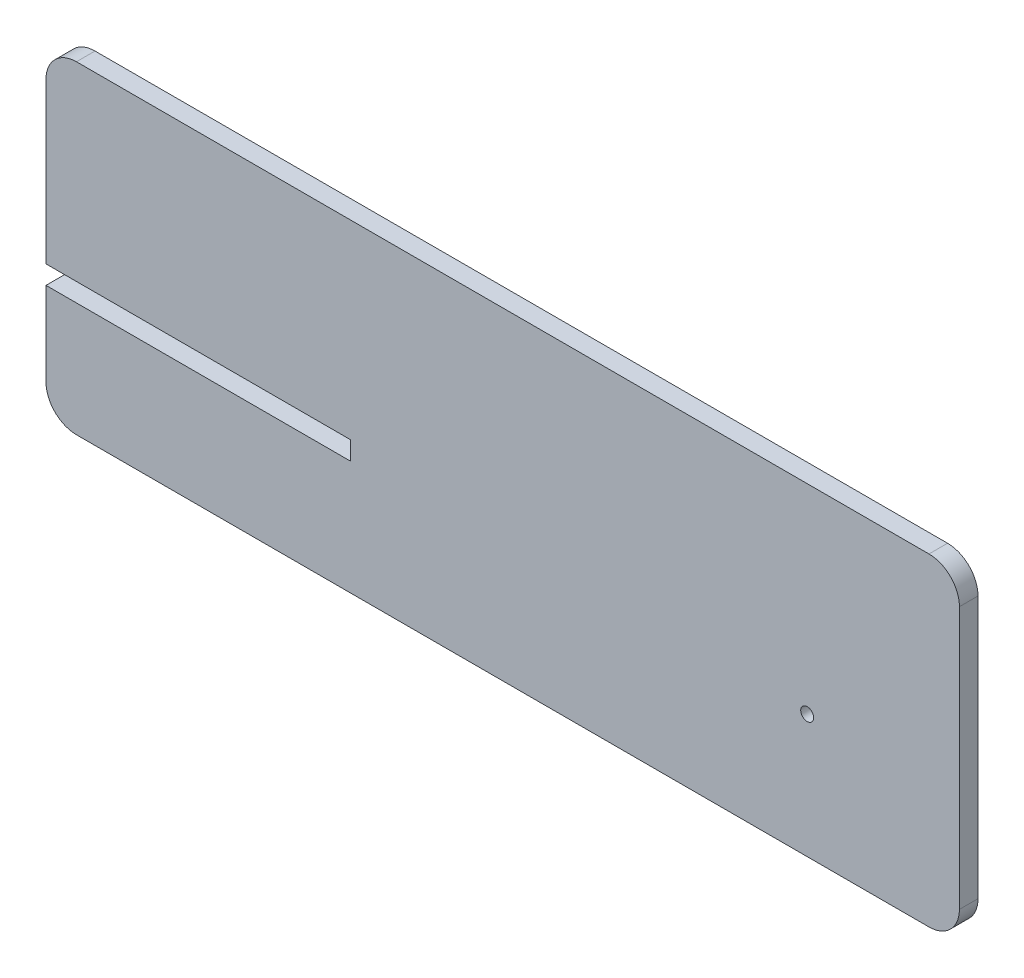
ISO-10303-21;
HEADER;
FILE_DESCRIPTION(('STEP AP214'),'2;1');
FILE_NAME('part.step','',(''),(''),'','','');
FILE_SCHEMA(('AUTOMOTIVE_DESIGN { 1 0 10303 214 1 1 1 1 }'));
ENDSEC;
DATA;
#1=APPLICATION_CONTEXT('core data for automotive mechanical design processes');
#2=APPLICATION_PROTOCOL_DEFINITION('international standard','automotive_design',2000,#1);
#3=PRODUCT_CONTEXT('',#1,'mechanical');
#4=PRODUCT('Part','Part','',(#3));
#5=PRODUCT_RELATED_PRODUCT_CATEGORY('part','',(#4));
#6=PRODUCT_DEFINITION_FORMATION('','',#4);
#7=PRODUCT_DEFINITION_CONTEXT('part definition',#1,'design');
#8=PRODUCT_DEFINITION('design','',#6,#7);
#9=PRODUCT_DEFINITION_SHAPE('','',#8);
#10=(LENGTH_UNIT() NAMED_UNIT(*) SI_UNIT(.MILLI.,.METRE.));
#11=(NAMED_UNIT(*) PLANE_ANGLE_UNIT() SI_UNIT($,.RADIAN.));
#12=(NAMED_UNIT(*) SI_UNIT($,.STERADIAN.) SOLID_ANGLE_UNIT());
#13=UNCERTAINTY_MEASURE_WITH_UNIT(LENGTH_MEASURE(1.E-05),#10,'distance_accuracy_value','');
#14=(GEOMETRIC_REPRESENTATION_CONTEXT(3) GLOBAL_UNCERTAINTY_ASSIGNED_CONTEXT((#13)) GLOBAL_UNIT_ASSIGNED_CONTEXT((#10,
#11,#12)) REPRESENTATION_CONTEXT('',''));
#15=CARTESIAN_POINT('',(0.,0.,0.));
#16=DIRECTION('',(0.,0.,1.));
#17=DIRECTION('',(1.,0.,0.));
#18=AXIS2_PLACEMENT_3D('',#15,#16,#17);
#19=CARTESIAN_POINT('',(-50.8,1.5494,3.0988));
#20=DIRECTION('',(1.,0.,0.));
#21=DIRECTION('',(0.,0.,-1.));
#22=AXIS2_PLACEMENT_3D('',#19,#20,#21);
#23=PLANE('',#22);
#24=DIRECTION('',(0.,-1.,0.));
#25=VECTOR('',#24,1.);
#26=CARTESIAN_POINT('',(-50.8,1.5494,3.0988));
#27=LINE('',#26,#25);
#28=CARTESIAN_POINT('',(-50.8,28.2194,3.0988));
#29=VERTEX_POINT('',#28);
#30=CARTESIAN_POINT('',(-50.8,1.5494,3.0988));
#31=VERTEX_POINT('',#30);
#32=EDGE_CURVE('E126',#29,#31,#27,.T.);
#33=ORIENTED_EDGE('',*,*,#32,.F.);
#34=DIRECTION('',(0.,0.,-1.));
#35=VECTOR('',#34,1.);
#36=CARTESIAN_POINT('',(-50.8,28.2194,3.0988));
#37=LINE('',#36,#35);
#38=CARTESIAN_POINT('',(-50.8,28.2194,0.));
#39=VERTEX_POINT('',#38);
#40=EDGE_CURVE('E11',#29,#39,#37,.T.);
#41=ORIENTED_EDGE('',*,*,#40,.T.);
#42=DIRECTION('',(0.,-1.,0.));
#43=VECTOR('',#42,1.);
#44=CARTESIAN_POINT('',(-50.8,1.5494,0.));
#45=LINE('',#44,#43);
#46=CARTESIAN_POINT('',(-50.8,1.5494,0.));
#47=VERTEX_POINT('',#46);
#48=EDGE_CURVE('E144',#39,#47,#45,.T.);
#49=ORIENTED_EDGE('',*,*,#48,.T.);
#50=DIRECTION('',(0.,0.,-1.));
#51=VECTOR('',#50,1.);
#52=CARTESIAN_POINT('',(-50.8,1.5494,3.0988));
#53=LINE('',#52,#51);
#54=EDGE_CURVE('E142',#31,#47,#53,.T.);
#55=ORIENTED_EDGE('',*,*,#54,.F.);
#56=EDGE_LOOP('',(#33,#41,#49,#55));
#57=FACE_BOUND('',#56,.T.);
#58=ADVANCED_FACE('F37',(#57),#23,.F.);
#59=CARTESIAN_POINT('',(-50.8,1.5494,3.0988));
#60=DIRECTION('',(0.,1.,0.));
#61=DIRECTION('',(-1.,0.,0.));
#62=AXIS2_PLACEMENT_3D('',#59,#60,#61);
#63=PLANE('',#62);
#64=DIRECTION('',(1.,0.,0.));
#65=VECTOR('',#64,1.);
#66=CARTESIAN_POINT('',(-50.8,1.5494,0.));
#67=LINE('',#66,#65);
#68=CARTESIAN_POINT('',(0.,1.5494,0.));
#69=VERTEX_POINT('',#68);
#70=EDGE_CURVE('E164',#47,#69,#67,.T.);
#71=ORIENTED_EDGE('',*,*,#70,.T.);
#72=DIRECTION('',(0.,0.,-1.));
#73=VECTOR('',#72,1.);
#74=CARTESIAN_POINT('',(0.,1.5494,3.0988));
#75=LINE('',#74,#73);
#76=CARTESIAN_POINT('',(0.,1.5494,3.0988));
#77=VERTEX_POINT('',#76);
#78=EDGE_CURVE('E148',#77,#69,#75,.T.);
#79=ORIENTED_EDGE('',*,*,#78,.F.);
#80=DIRECTION('',(1.,0.,0.));
#81=VECTOR('',#80,1.);
#82=CARTESIAN_POINT('',(-50.8,1.5494,3.0988));
#83=LINE('',#82,#81);
#84=EDGE_CURVE('E132',#31,#77,#83,.T.);
#85=ORIENTED_EDGE('',*,*,#84,.F.);
#86=ORIENTED_EDGE('',*,*,#54,.T.);
#87=EDGE_LOOP('',(#71,#79,#85,#86));
#88=FACE_BOUND('',#87,.T.);
#89=ADVANCED_FACE('F150',(#88),#63,.F.);
#90=CARTESIAN_POINT('',(0.,1.5494,3.0988));
#91=DIRECTION('',(1.,0.,0.));
#92=DIRECTION('',(0.,1.,0.));
#93=AXIS2_PLACEMENT_3D('',#90,#91,#92);
#94=PLANE('',#93);
#95=DIRECTION('',(0.,-1.,0.));
#96=VECTOR('',#95,1.);
#97=CARTESIAN_POINT('',(0.,1.5494,0.));
#98=LINE('',#97,#96);
#99=CARTESIAN_POINT('',(0.,-1.5494,0.));
#100=VERTEX_POINT('',#99);
#101=EDGE_CURVE('E167',#69,#100,#98,.T.);
#102=ORIENTED_EDGE('',*,*,#101,.T.);
#103=DIRECTION('',(0.,0.,-1.));
#104=VECTOR('',#103,1.);
#105=CARTESIAN_POINT('',(0.,-1.5494,3.0988));
#106=LINE('',#105,#104);
#107=CARTESIAN_POINT('',(0.,-1.5494,3.0988));
#108=VERTEX_POINT('',#107);
#109=EDGE_CURVE('E175',#108,#100,#106,.T.);
#110=ORIENTED_EDGE('',*,*,#109,.F.);
#111=DIRECTION('',(0.,-1.,0.));
#112=VECTOR('',#111,1.);
#113=CARTESIAN_POINT('',(0.,1.5494,3.0988));
#114=LINE('',#113,#112);
#115=EDGE_CURVE('E153',#77,#108,#114,.T.);
#116=ORIENTED_EDGE('',*,*,#115,.F.);
#117=ORIENTED_EDGE('',*,*,#78,.T.);
#118=EDGE_LOOP('',(#102,#110,#116,#117));
#119=FACE_BOUND('',#118,.T.);
#120=ADVANCED_FACE('F264',(#119),#94,.F.);
#121=CARTESIAN_POINT('',(-50.8,-1.5494,3.0988));
#122=DIRECTION('',(0.,-1.,0.));
#123=DIRECTION('',(1.,0.,0.));
#124=AXIS2_PLACEMENT_3D('',#121,#122,#123);
#125=PLANE('',#124);
#126=DIRECTION('',(-1.,0.,0.));
#127=VECTOR('',#126,1.);
#128=CARTESIAN_POINT('',(-50.8,-1.5494,0.));
#129=LINE('',#128,#127);
#130=CARTESIAN_POINT('',(-50.8,-1.5494,0.));
#131=VERTEX_POINT('',#130);
#132=EDGE_CURVE('E169',#100,#131,#129,.T.);
#133=ORIENTED_EDGE('',*,*,#132,.T.);
#134=DIRECTION('',(0.,0.,-1.));
#135=VECTOR('',#134,1.);
#136=CARTESIAN_POINT('',(-50.8,-1.5494,3.0988));
#137=LINE('',#136,#135);
#138=CARTESIAN_POINT('',(-50.8,-1.5494,3.0988));
#139=VERTEX_POINT('',#138);
#140=EDGE_CURVE('E162',#139,#131,#137,.T.);
#141=ORIENTED_EDGE('',*,*,#140,.F.);
#142=DIRECTION('',(-1.,0.,0.));
#143=VECTOR('',#142,1.);
#144=CARTESIAN_POINT('',(-50.8,-1.5494,3.0988));
#145=LINE('',#144,#143);
#146=EDGE_CURVE('E155',#108,#139,#145,.T.);
#147=ORIENTED_EDGE('',*,*,#146,.F.);
#148=ORIENTED_EDGE('',*,*,#109,.T.);
#149=EDGE_LOOP('',(#133,#141,#147,#148));
#150=FACE_BOUND('',#149,.T.);
#151=ADVANCED_FACE('F293',(#150),#125,.F.);
#152=CARTESIAN_POINT('',(-50.8,-7.8994,3.0988));
#153=DIRECTION('',(1.,0.,0.));
#154=DIRECTION('',(0.,0.,-1.));
#155=AXIS2_PLACEMENT_3D('',#152,#153,#154);
#156=PLANE('',#155);
#157=DIRECTION('',(0.,-1.,0.));
#158=VECTOR('',#157,1.);
#159=CARTESIAN_POINT('',(-50.8,-7.8994,0.));
#160=LINE('',#159,#158);
#161=CARTESIAN_POINT('',(-50.8,-15.5194,0.));
#162=VERTEX_POINT('',#161);
#163=EDGE_CURVE('E139',#131,#162,#160,.T.);
#164=ORIENTED_EDGE('',*,*,#163,.T.);
#165=DIRECTION('',(0.,0.,-1.));
#166=VECTOR('',#165,1.);
#167=CARTESIAN_POINT('',(-50.8,-15.5194,3.0988));
#168=LINE('',#167,#166);
#169=CARTESIAN_POINT('',(-50.8,-15.5194,3.0988));
#170=VERTEX_POINT('',#169);
#171=EDGE_CURVE('E45',#162,#170,#168,.F.);
#172=ORIENTED_EDGE('',*,*,#171,.T.);
#173=DIRECTION('',(0.,-1.,0.));
#174=VECTOR('',#173,1.);
#175=CARTESIAN_POINT('',(-50.8,-7.8994,3.0988));
#176=LINE('',#175,#174);
#177=EDGE_CURVE('E160',#139,#170,#176,.T.);
#178=ORIENTED_EDGE('',*,*,#177,.F.);
#179=ORIENTED_EDGE('',*,*,#140,.T.);
#180=EDGE_LOOP('',(#164,#172,#178,#179));
#181=FACE_BOUND('',#180,.T.);
#182=ADVANCED_FACE('F208',(#181),#156,.F.);
#183=CARTESIAN_POINT('',(0.,0.,3.0988));
#184=DIRECTION('',(0.,0.,-1.));
#185=DIRECTION('',(-1.,0.,0.));
#186=AXIS2_PLACEMENT_3D('',#183,#184,#185);
#187=PLANE('',#186);
#188=DIRECTION('',(0.,1.,0.));
#189=VECTOR('',#188,1.);
#190=CARTESIAN_POINT('',(101.6,0.,3.0988));
#191=LINE('',#190,#189);
#192=CARTESIAN_POINT('',(101.6,-15.5194,3.0988));
#193=VERTEX_POINT('',#192);
#194=CARTESIAN_POINT('',(101.6,28.2194,3.0988));
#195=VERTEX_POINT('',#194);
#196=EDGE_CURVE('E226',#193,#195,#191,.T.);
#197=ORIENTED_EDGE('',*,*,#196,.T.);
#198=CARTESIAN_POINT('',(96.52,28.2194,3.0988));
#199=DIRECTION('',(0.,0.,-1.));
#200=DIRECTION('',(-1.,0.,0.));
#201=AXIS2_PLACEMENT_3D('',#198,#199,#200);
#202=CIRCLE('',#201,5.08);
#203=CARTESIAN_POINT('',(96.52,33.2994,3.0988));
#204=VERTEX_POINT('',#203);
#205=EDGE_CURVE('E200',#195,#204,#202,.F.);
#206=ORIENTED_EDGE('',*,*,#205,.T.);
#207=DIRECTION('',(-1.,0.,0.));
#208=VECTOR('',#207,1.);
#209=CARTESIAN_POINT('',(0.,33.2994,3.0988));
#210=LINE('',#209,#208);
#211=CARTESIAN_POINT('',(-45.72,33.2994,3.0988));
#212=VERTEX_POINT('',#211);
#213=EDGE_CURVE('E238',#204,#212,#210,.T.);
#214=ORIENTED_EDGE('',*,*,#213,.T.);
#215=CARTESIAN_POINT('',(-45.72,28.2194,3.0988));
#216=DIRECTION('',(0.,0.,-1.));
#217=DIRECTION('',(-1.,0.,0.));
#218=AXIS2_PLACEMENT_3D('',#215,#216,#217);
#219=CIRCLE('',#218,5.08);
#220=EDGE_CURVE('E136',#212,#29,#219,.F.);
#221=ORIENTED_EDGE('',*,*,#220,.T.);
#222=ORIENTED_EDGE('',*,*,#32,.T.);
#223=ORIENTED_EDGE('',*,*,#84,.T.);
#224=ORIENTED_EDGE('',*,*,#115,.T.);
#225=ORIENTED_EDGE('',*,*,#146,.T.);
#226=ORIENTED_EDGE('',*,*,#177,.T.);
#227=CARTESIAN_POINT('',(-45.72,-15.5194,3.0988));
#228=DIRECTION('',(0.,0.,-1.));
#229=DIRECTION('',(-1.,0.,0.));
#230=AXIS2_PLACEMENT_3D('',#227,#228,#229);
#231=CIRCLE('',#230,5.08);
#232=CARTESIAN_POINT('',(-45.72,-20.5994,3.0988));
#233=VERTEX_POINT('',#232);
#234=EDGE_CURVE('E59',#170,#233,#231,.F.);
#235=ORIENTED_EDGE('',*,*,#234,.T.);
#236=DIRECTION('',(1.,0.,0.));
#237=VECTOR('',#236,1.);
#238=CARTESIAN_POINT('',(0.,-20.5994,3.0988));
#239=LINE('',#238,#237);
#240=CARTESIAN_POINT('',(96.52,-20.5994,3.0988));
#241=VERTEX_POINT('',#240);
#242=EDGE_CURVE('E165',#233,#241,#239,.T.);
#243=ORIENTED_EDGE('',*,*,#242,.T.);
#244=CARTESIAN_POINT('',(96.52,-15.5194,3.0988));
#245=DIRECTION('',(0.,0.,-1.));
#246=DIRECTION('',(-1.,0.,0.));
#247=AXIS2_PLACEMENT_3D('',#244,#245,#246);
#248=CIRCLE('',#247,5.08);
#249=EDGE_CURVE('E198',#241,#193,#248,.F.);
#250=ORIENTED_EDGE('',*,*,#249,.T.);
#251=EDGE_LOOP('',(#197,#206,#214,#221,#222,#223,#224,#225,#226,#235,#243,#250));
#252=FACE_BOUND('',#251,.T.);
#253=CARTESIAN_POINT('',(76.2,0.,3.0988));
#254=DIRECTION('',(0.,0.,1.));
#255=DIRECTION('',(1.,0.,0.));
#256=AXIS2_PLACEMENT_3D('',#253,#254,#255);
#257=CIRCLE('',#256,1.0795);
#258=CARTESIAN_POINT('',(77.2795,0.,3.0988));
#259=VERTEX_POINT('',#258);
#260=EDGE_CURVE('E223',#259,#259,#257,.T.);
#261=ORIENTED_EDGE('',*,*,#260,.F.);
#262=EDGE_LOOP('',(#261));
#263=FACE_BOUND('',#262,.T.);
#264=ADVANCED_FACE('F129',(#252,#263),#187,.F.);
#265=CARTESIAN_POINT('',(0.,0.,0.));
#266=DIRECTION('',(0.,0.,-1.));
#267=DIRECTION('',(-1.,0.,0.));
#268=AXIS2_PLACEMENT_3D('',#265,#266,#267);
#269=PLANE('',#268);
#270=DIRECTION('',(-1.,0.,0.));
#271=VECTOR('',#270,1.);
#272=CARTESIAN_POINT('',(0.,33.2994,0.));
#273=LINE('',#272,#271);
#274=CARTESIAN_POINT('',(96.52,33.2994,0.));
#275=VERTEX_POINT('',#274);
#276=CARTESIAN_POINT('',(-45.72,33.2994,0.));
#277=VERTEX_POINT('',#276);
#278=EDGE_CURVE('E224',#275,#277,#273,.T.);
#279=ORIENTED_EDGE('',*,*,#278,.F.);
#280=CARTESIAN_POINT('',(96.52,28.2194,0.));
#281=DIRECTION('',(0.,0.,-1.));
#282=DIRECTION('',(-1.,0.,0.));
#283=AXIS2_PLACEMENT_3D('',#280,#281,#282);
#284=CIRCLE('',#283,5.08);
#285=CARTESIAN_POINT('',(101.6,28.2194,0.));
#286=VERTEX_POINT('',#285);
#287=EDGE_CURVE('E189',#275,#286,#284,.T.);
#288=ORIENTED_EDGE('',*,*,#287,.T.);
#289=DIRECTION('',(0.,1.,0.));
#290=VECTOR('',#289,1.);
#291=CARTESIAN_POINT('',(101.6,0.,0.));
#292=LINE('',#291,#290);
#293=CARTESIAN_POINT('',(101.6,-15.5194,0.));
#294=VERTEX_POINT('',#293);
#295=EDGE_CURVE('E229',#294,#286,#292,.T.);
#296=ORIENTED_EDGE('',*,*,#295,.F.);
#297=CARTESIAN_POINT('',(96.52,-15.5194,0.));
#298=DIRECTION('',(0.,0.,-1.));
#299=DIRECTION('',(-1.,0.,0.));
#300=AXIS2_PLACEMENT_3D('',#297,#298,#299);
#301=CIRCLE('',#300,5.08);
#302=CARTESIAN_POINT('',(96.52,-20.5994,0.));
#303=VERTEX_POINT('',#302);
#304=EDGE_CURVE('E187',#294,#303,#301,.T.);
#305=ORIENTED_EDGE('',*,*,#304,.T.);
#306=DIRECTION('',(1.,0.,0.));
#307=VECTOR('',#306,1.);
#308=CARTESIAN_POINT('',(0.,-20.5994,0.));
#309=LINE('',#308,#307);
#310=CARTESIAN_POINT('',(-45.72,-20.5994,0.));
#311=VERTEX_POINT('',#310);
#312=EDGE_CURVE('E217',#311,#303,#309,.T.);
#313=ORIENTED_EDGE('',*,*,#312,.F.);
#314=CARTESIAN_POINT('',(-45.72,-15.5194,0.));
#315=DIRECTION('',(0.,0.,-1.));
#316=DIRECTION('',(-1.,0.,0.));
#317=AXIS2_PLACEMENT_3D('',#314,#315,#316);
#318=CIRCLE('',#317,5.08);
#319=EDGE_CURVE('E185',#311,#162,#318,.T.);
#320=ORIENTED_EDGE('',*,*,#319,.T.);
#321=ORIENTED_EDGE('',*,*,#163,.F.);
#322=ORIENTED_EDGE('',*,*,#132,.F.);
#323=ORIENTED_EDGE('',*,*,#101,.F.);
#324=ORIENTED_EDGE('',*,*,#70,.F.);
#325=ORIENTED_EDGE('',*,*,#48,.F.);
#326=CARTESIAN_POINT('',(-45.72,28.2194,0.));
#327=DIRECTION('',(0.,0.,-1.));
#328=DIRECTION('',(-1.,0.,0.));
#329=AXIS2_PLACEMENT_3D('',#326,#327,#328);
#330=CIRCLE('',#329,5.08);
#331=EDGE_CURVE('E183',#39,#277,#330,.T.);
#332=ORIENTED_EDGE('',*,*,#331,.T.);
#333=EDGE_LOOP('',(#279,#288,#296,#305,#313,#320,#321,#322,#323,#324,#325,#332));
#334=FACE_BOUND('',#333,.T.);
#335=CARTESIAN_POINT('',(76.2,0.,0.));
#336=DIRECTION('',(0.,0.,1.));
#337=DIRECTION('',(1.,0.,0.));
#338=AXIS2_PLACEMENT_3D('',#335,#336,#337);
#339=CIRCLE('',#338,1.0795);
#340=CARTESIAN_POINT('',(77.2795,0.,0.));
#341=VERTEX_POINT('',#340);
#342=EDGE_CURVE('E234',#341,#341,#339,.T.);
#343=ORIENTED_EDGE('',*,*,#342,.T.);
#344=EDGE_LOOP('',(#343));
#345=FACE_BOUND('',#344,.T.);
#346=ADVANCED_FACE('F220',(#334,#345),#269,.T.);
#347=CARTESIAN_POINT('',(101.6,0.,3.0988));
#348=DIRECTION('',(-1.,0.,0.));
#349=DIRECTION('',(0.,0.,1.));
#350=AXIS2_PLACEMENT_3D('',#347,#348,#349);
#351=PLANE('',#350);
#352=ORIENTED_EDGE('',*,*,#295,.T.);
#353=DIRECTION('',(0.,0.,-1.));
#354=VECTOR('',#353,1.);
#355=CARTESIAN_POINT('',(101.6,28.2194,3.0988));
#356=LINE('',#355,#354);
#357=EDGE_CURVE('E194',#286,#195,#356,.F.);
#358=ORIENTED_EDGE('',*,*,#357,.T.);
#359=ORIENTED_EDGE('',*,*,#196,.F.);
#360=DIRECTION('',(0.,0.,-1.));
#361=VECTOR('',#360,1.);
#362=CARTESIAN_POINT('',(101.6,-15.5194,3.0988));
#363=LINE('',#362,#361);
#364=EDGE_CURVE('E191',#193,#294,#363,.T.);
#365=ORIENTED_EDGE('',*,*,#364,.T.);
#366=EDGE_LOOP('',(#352,#358,#359,#365));
#367=FACE_BOUND('',#366,.T.);
#368=ADVANCED_FACE('F274',(#367),#351,.F.);
#369=CARTESIAN_POINT('',(0.,33.2994,3.0988));
#370=DIRECTION('',(0.,-1.,0.));
#371=DIRECTION('',(0.,0.,-1.));
#372=AXIS2_PLACEMENT_3D('',#369,#370,#371);
#373=PLANE('',#372);
#374=ORIENTED_EDGE('',*,*,#213,.F.);
#375=DIRECTION('',(0.,0.,-1.));
#376=VECTOR('',#375,1.);
#377=CARTESIAN_POINT('',(96.52,33.2994,3.0988));
#378=LINE('',#377,#376);
#379=EDGE_CURVE('E180',#204,#275,#378,.T.);
#380=ORIENTED_EDGE('',*,*,#379,.T.);
#381=ORIENTED_EDGE('',*,*,#278,.T.);
#382=DIRECTION('',(0.,0.,-1.));
#383=VECTOR('',#382,1.);
#384=CARTESIAN_POINT('',(-45.72,33.2994,3.0988));
#385=LINE('',#384,#383);
#386=EDGE_CURVE('E147',#277,#212,#385,.F.);
#387=ORIENTED_EDGE('',*,*,#386,.T.);
#388=EDGE_LOOP('',(#374,#380,#381,#387));
#389=FACE_BOUND('',#388,.T.);
#390=ADVANCED_FACE('F251',(#389),#373,.F.);
#391=CARTESIAN_POINT('',(76.2,0.,3.0988));
#392=DIRECTION('',(0.,0.,-1.));
#393=DIRECTION('',(-1.,0.,0.));
#394=AXIS2_PLACEMENT_3D('',#391,#392,#393);
#395=CYLINDRICAL_SURFACE('',#394,1.0795);
#396=ORIENTED_EDGE('',*,*,#260,.T.);
#397=EDGE_LOOP('',(#396));
#398=FACE_BOUND('',#397,.T.);
#399=ORIENTED_EDGE('',*,*,#342,.F.);
#400=EDGE_LOOP('',(#399));
#401=FACE_BOUND('',#400,.T.);
#402=ADVANCED_FACE('F281',(#398,#401),#395,.F.);
#403=CARTESIAN_POINT('',(0.,-20.5994,3.0988));
#404=DIRECTION('',(0.,1.,0.));
#405=DIRECTION('',(-1.,0.,0.));
#406=AXIS2_PLACEMENT_3D('',#403,#404,#405);
#407=PLANE('',#406);
#408=ORIENTED_EDGE('',*,*,#312,.T.);
#409=DIRECTION('',(0.,0.,-1.));
#410=VECTOR('',#409,1.);
#411=CARTESIAN_POINT('',(96.52,-20.5994,3.0988));
#412=LINE('',#411,#410);
#413=EDGE_CURVE('E52',#303,#241,#412,.F.);
#414=ORIENTED_EDGE('',*,*,#413,.T.);
#415=ORIENTED_EDGE('',*,*,#242,.F.);
#416=DIRECTION('',(0.,0.,-1.));
#417=VECTOR('',#416,1.);
#418=CARTESIAN_POINT('',(-45.72,-20.5994,3.0988));
#419=LINE('',#418,#417);
#420=EDGE_CURVE('E202',#233,#311,#419,.T.);
#421=ORIENTED_EDGE('',*,*,#420,.T.);
#422=EDGE_LOOP('',(#408,#414,#415,#421));
#423=FACE_BOUND('',#422,.T.);
#424=ADVANCED_FACE('F216',(#423),#407,.F.);
#425=CARTESIAN_POINT('',(96.52,28.2194,3.0988));
#426=DIRECTION('',(0.,0.,-1.));
#427=DIRECTION('',(-1.,0.,0.));
#428=AXIS2_PLACEMENT_3D('',#425,#426,#427);
#429=CYLINDRICAL_SURFACE('',#428,5.08);
#430=ORIENTED_EDGE('',*,*,#205,.F.);
#431=ORIENTED_EDGE('',*,*,#357,.F.);
#432=ORIENTED_EDGE('',*,*,#287,.F.);
#433=ORIENTED_EDGE('',*,*,#379,.F.);
#434=EDGE_LOOP('',(#430,#431,#432,#433));
#435=FACE_BOUND('',#434,.T.);
#436=ADVANCED_FACE('F249',(#435),#429,.T.);
#437=CARTESIAN_POINT('',(96.52,-15.5194,3.0988));
#438=DIRECTION('',(0.,0.,-1.));
#439=DIRECTION('',(-1.,0.,0.));
#440=AXIS2_PLACEMENT_3D('',#437,#438,#439);
#441=CYLINDRICAL_SURFACE('',#440,5.08);
#442=ORIENTED_EDGE('',*,*,#249,.F.);
#443=ORIENTED_EDGE('',*,*,#413,.F.);
#444=ORIENTED_EDGE('',*,*,#304,.F.);
#445=ORIENTED_EDGE('',*,*,#364,.F.);
#446=EDGE_LOOP('',(#442,#443,#444,#445));
#447=FACE_BOUND('',#446,.T.);
#448=ADVANCED_FACE('F258',(#447),#441,.T.);
#449=CARTESIAN_POINT('',(-45.72,-15.5194,3.0988));
#450=DIRECTION('',(0.,0.,-1.));
#451=DIRECTION('',(-1.,0.,0.));
#452=AXIS2_PLACEMENT_3D('',#449,#450,#451);
#453=CYLINDRICAL_SURFACE('',#452,5.08);
#454=ORIENTED_EDGE('',*,*,#234,.F.);
#455=ORIENTED_EDGE('',*,*,#171,.F.);
#456=ORIENTED_EDGE('',*,*,#319,.F.);
#457=ORIENTED_EDGE('',*,*,#420,.F.);
#458=EDGE_LOOP('',(#454,#455,#456,#457));
#459=FACE_BOUND('',#458,.T.);
#460=ADVANCED_FACE('F214',(#459),#453,.T.);
#461=CARTESIAN_POINT('',(-45.72,28.2194,3.0988));
#462=DIRECTION('',(0.,0.,-1.));
#463=DIRECTION('',(-1.,0.,0.));
#464=AXIS2_PLACEMENT_3D('',#461,#462,#463);
#465=CYLINDRICAL_SURFACE('',#464,5.08);
#466=ORIENTED_EDGE('',*,*,#220,.F.);
#467=ORIENTED_EDGE('',*,*,#386,.F.);
#468=ORIENTED_EDGE('',*,*,#331,.F.);
#469=ORIENTED_EDGE('',*,*,#40,.F.);
#470=EDGE_LOOP('',(#466,#467,#468,#469));
#471=FACE_BOUND('',#470,.T.);
#472=ADVANCED_FACE('F39',(#471),#465,.T.);
#473=CLOSED_SHELL('',(#58,#89,#120,#151,#182,#264,#346,#368,#390,#402,#424,#436,#448,#460,#472));
#474=MANIFOLD_SOLID_BREP('B2',#473);
#475=ADVANCED_BREP_SHAPE_REPRESENTATION('',(#18,#474),#14);
#476=SHAPE_DEFINITION_REPRESENTATION(#9,#475);
ENDSEC;
END-ISO-10303-21;
